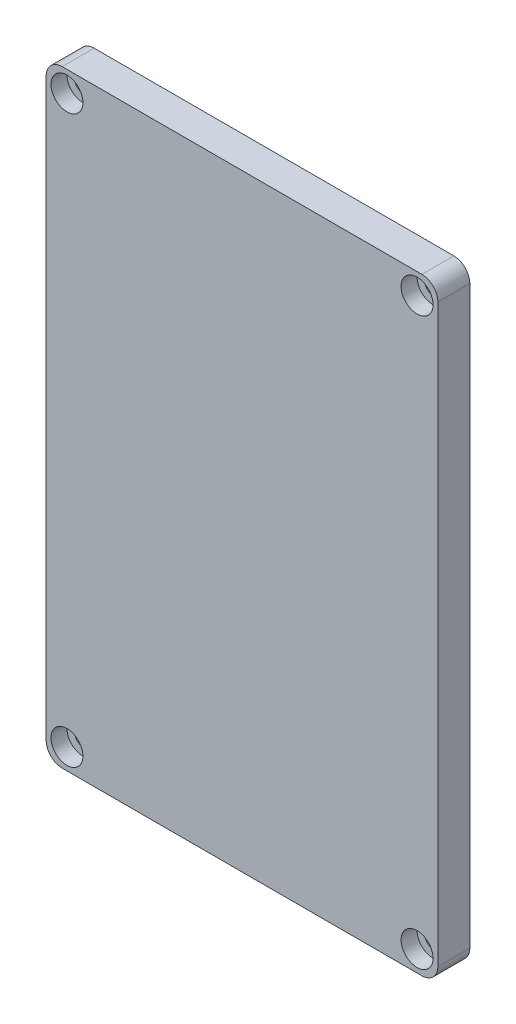
ISO-10303-21;
HEADER;
FILE_DESCRIPTION(('STEP AP214'),'2;1');
FILE_NAME('part.step','',(''),(''),'','','');
FILE_SCHEMA(('AUTOMOTIVE_DESIGN { 1 0 10303 214 1 1 1 1 }'));
ENDSEC;
DATA;
#1=APPLICATION_CONTEXT('core data for automotive mechanical design processes');
#2=APPLICATION_PROTOCOL_DEFINITION('international standard','automotive_design',2000,#1);
#3=PRODUCT_CONTEXT('',#1,'mechanical');
#4=PRODUCT('Part','Part','',(#3));
#5=PRODUCT_RELATED_PRODUCT_CATEGORY('part','',(#4));
#6=PRODUCT_DEFINITION_FORMATION('','',#4);
#7=PRODUCT_DEFINITION_CONTEXT('part definition',#1,'design');
#8=PRODUCT_DEFINITION('design','',#6,#7);
#9=PRODUCT_DEFINITION_SHAPE('','',#8);
#10=(LENGTH_UNIT() NAMED_UNIT(*) SI_UNIT(.MILLI.,.METRE.));
#11=(NAMED_UNIT(*) PLANE_ANGLE_UNIT() SI_UNIT($,.RADIAN.));
#12=(NAMED_UNIT(*) SI_UNIT($,.STERADIAN.) SOLID_ANGLE_UNIT());
#13=UNCERTAINTY_MEASURE_WITH_UNIT(LENGTH_MEASURE(1.E-05),#10,'distance_accuracy_value','');
#14=(GEOMETRIC_REPRESENTATION_CONTEXT(3) GLOBAL_UNCERTAINTY_ASSIGNED_CONTEXT((#13)) GLOBAL_UNIT_ASSIGNED_CONTEXT((#10,
#11,#12)) REPRESENTATION_CONTEXT('',''));
#15=CARTESIAN_POINT('',(0.,0.,0.));
#16=DIRECTION('',(0.,0.,1.));
#17=DIRECTION('',(1.,0.,0.));
#18=AXIS2_PLACEMENT_3D('',#15,#16,#17);
#19=CARTESIAN_POINT('',(0.,0.,0.));
#20=DIRECTION('',(0.,0.,-1.));
#21=DIRECTION('',(-1.,0.,0.));
#22=AXIS2_PLACEMENT_3D('',#19,#20,#21);
#23=PLANE('',#22);
#24=CARTESIAN_POINT('',(-120.990086771129,76.4285838497429,0.));
#25=DIRECTION('',(0.,0.,-1.));
#26=DIRECTION('',(-1.,0.,0.));
#27=AXIS2_PLACEMENT_3D('',#24,#25,#26);
#28=CIRCLE('',#27,0.499999999999999);
#29=CARTESIAN_POINT('',(-121.490086771129,76.4285838497429,0.));
#30=VERTEX_POINT('',#29);
#31=EDGE_CURVE('E227',#30,#30,#28,.F.);
#32=ORIENTED_EDGE('',*,*,#31,.T.);
#33=EDGE_LOOP('',(#32));
#34=FACE_BOUND('',#33,.T.);
#35=CARTESIAN_POINT('',(-99.0900867711287,76.4285838497429,0.));
#36=DIRECTION('',(0.,0.,-1.));
#37=DIRECTION('',(-1.,0.,0.));
#38=AXIS2_PLACEMENT_3D('',#35,#36,#37);
#39=CIRCLE('',#38,0.499999999999999);
#40=CARTESIAN_POINT('',(-99.5900867711287,76.4285838497429,0.));
#41=VERTEX_POINT('',#40);
#42=EDGE_CURVE('E241',#41,#41,#39,.F.);
#43=ORIENTED_EDGE('',*,*,#42,.T.);
#44=EDGE_LOOP('',(#43));
#45=FACE_BOUND('',#44,.T.);
#46=CARTESIAN_POINT('',(-99.0900867711287,41.028583849743,0.));
#47=DIRECTION('',(0.,0.,-1.));
#48=DIRECTION('',(-1.,0.,0.));
#49=AXIS2_PLACEMENT_3D('',#46,#47,#48);
#50=CIRCLE('',#49,0.499999999999999);
#51=CARTESIAN_POINT('',(-99.5900867711287,41.028583849743,0.));
#52=VERTEX_POINT('',#51);
#53=EDGE_CURVE('E233',#52,#52,#50,.F.);
#54=ORIENTED_EDGE('',*,*,#53,.T.);
#55=EDGE_LOOP('',(#54));
#56=FACE_BOUND('',#55,.T.);
#57=CARTESIAN_POINT('',(-120.990086771129,41.028583849743,0.));
#58=DIRECTION('',(0.,0.,-1.));
#59=DIRECTION('',(-1.,0.,0.));
#60=AXIS2_PLACEMENT_3D('',#57,#58,#59);
#61=CIRCLE('',#60,0.499999999999999);
#62=CARTESIAN_POINT('',(-121.490086771129,41.028583849743,0.));
#63=VERTEX_POINT('',#62);
#64=EDGE_CURVE('E232',#63,#63,#61,.F.);
#65=ORIENTED_EDGE('',*,*,#64,.T.);
#66=EDGE_LOOP('',(#65));
#67=FACE_BOUND('',#66,.T.);
#68=CARTESIAN_POINT('',(-118.450086771129,67.7285838497429,0.));
#69=DIRECTION('',(0.,0.,-1.));
#70=DIRECTION('',(-1.,0.,0.));
#71=AXIS2_PLACEMENT_3D('',#68,#69,#70);
#72=CIRCLE('',#71,2.04999999999999);
#73=CARTESIAN_POINT('',(-120.500086771129,67.7285838497429,0.));
#74=VERTEX_POINT('',#73);
#75=EDGE_CURVE('E288',#74,#74,#72,.T.);
#76=ORIENTED_EDGE('',*,*,#75,.F.);
#77=EDGE_LOOP('',(#76));
#78=FACE_BOUND('',#77,.T.);
#79=DIRECTION('',(-1.,0.,0.));
#80=VECTOR('',#79,1.);
#81=CARTESIAN_POINT('',(-97.7900867711287,77.7285838497429,0.));
#82=LINE('',#81,#80);
#83=CARTESIAN_POINT('',(-98.7900867711287,77.7285838497429,0.));
#84=VERTEX_POINT('',#83);
#85=CARTESIAN_POINT('',(-121.290086771129,77.7285838497429,0.));
#86=VERTEX_POINT('',#85);
#87=EDGE_CURVE('E321',#84,#86,#82,.T.);
#88=ORIENTED_EDGE('',*,*,#87,.F.);
#89=CARTESIAN_POINT('',(-98.7900867711287,76.7285838497429,0.));
#90=DIRECTION('',(0.,0.,-1.));
#91=DIRECTION('',(-1.,0.,0.));
#92=AXIS2_PLACEMENT_3D('',#89,#90,#91);
#93=CIRCLE('',#92,1.);
#94=CARTESIAN_POINT('',(-97.7900867711287,76.7285838497429,0.));
#95=VERTEX_POINT('',#94);
#96=EDGE_CURVE('E347',#84,#95,#93,.T.);
#97=ORIENTED_EDGE('',*,*,#96,.T.);
#98=DIRECTION('',(0.,1.,0.));
#99=VECTOR('',#98,1.);
#100=CARTESIAN_POINT('',(-97.7900867711287,77.7285838497429,0.));
#101=LINE('',#100,#99);
#102=CARTESIAN_POINT('',(-97.7900867711287,40.7285838497429,0.));
#103=VERTEX_POINT('',#102);
#104=EDGE_CURVE('E296',#103,#95,#101,.T.);
#105=ORIENTED_EDGE('',*,*,#104,.F.);
#106=CARTESIAN_POINT('',(-98.7900867711287,40.7285838497429,0.));
#107=DIRECTION('',(0.,0.,-1.));
#108=DIRECTION('',(-1.,0.,0.));
#109=AXIS2_PLACEMENT_3D('',#106,#107,#108);
#110=CIRCLE('',#109,1.);
#111=CARTESIAN_POINT('',(-98.7900867711287,39.7285838497429,0.));
#112=VERTEX_POINT('',#111);
#113=EDGE_CURVE('E344',#103,#112,#110,.T.);
#114=ORIENTED_EDGE('',*,*,#113,.T.);
#115=DIRECTION('',(1.,0.,0.));
#116=VECTOR('',#115,1.);
#117=CARTESIAN_POINT('',(-97.7900867711287,39.7285838497429,0.));
#118=LINE('',#117,#116);
#119=CARTESIAN_POINT('',(-121.290086771129,39.7285838497429,0.));
#120=VERTEX_POINT('',#119);
#121=EDGE_CURVE('E305',#120,#112,#118,.T.);
#122=ORIENTED_EDGE('',*,*,#121,.F.);
#123=CARTESIAN_POINT('',(-121.290086771129,40.7285838497429,0.));
#124=DIRECTION('',(0.,0.,-1.));
#125=DIRECTION('',(-1.,0.,0.));
#126=AXIS2_PLACEMENT_3D('',#123,#124,#125);
#127=CIRCLE('',#126,1.);
#128=CARTESIAN_POINT('',(-122.290086771129,40.7285838497429,0.));
#129=VERTEX_POINT('',#128);
#130=EDGE_CURVE('E341',#120,#129,#127,.T.);
#131=ORIENTED_EDGE('',*,*,#130,.T.);
#132=DIRECTION('',(0.,-1.,0.));
#133=VECTOR('',#132,1.);
#134=CARTESIAN_POINT('',(-122.290086771129,77.7285838497429,0.));
#135=LINE('',#134,#133);
#136=CARTESIAN_POINT('',(-122.290086771129,76.7285838497429,0.));
#137=VERTEX_POINT('',#136);
#138=EDGE_CURVE('E325',#137,#129,#135,.T.);
#139=ORIENTED_EDGE('',*,*,#138,.F.);
#140=CARTESIAN_POINT('',(-121.290086771129,76.7285838497429,0.));
#141=DIRECTION('',(0.,0.,-1.));
#142=DIRECTION('',(-1.,0.,0.));
#143=AXIS2_PLACEMENT_3D('',#140,#141,#142);
#144=CIRCLE('',#143,1.);
#145=EDGE_CURVE('E338',#137,#86,#144,.T.);
#146=ORIENTED_EDGE('',*,*,#145,.T.);
#147=EDGE_LOOP('',(#88,#97,#105,#114,#122,#131,#139,#146));
#148=FACE_BOUND('',#147,.T.);
#149=DIRECTION('',(-1.,0.,0.));
#150=VECTOR('',#149,1.);
#151=CARTESIAN_POINT('',(-105.32713911598,64.4228752504134,0.));
#152=LINE('',#151,#150);
#153=CARTESIAN_POINT('',(-105.32713911598,64.4228752504134,0.));
#154=VERTEX_POINT('',#153);
#155=CARTESIAN_POINT('',(-111.090086771129,64.4228752504134,0.));
#156=VERTEX_POINT('',#155);
#157=EDGE_CURVE('E188',#154,#156,#152,.T.);
#158=ORIENTED_EDGE('',*,*,#157,.F.);
#159=DIRECTION('',(0.,-1.,0.));
#160=VECTOR('',#159,1.);
#161=CARTESIAN_POINT('',(-105.32713911598,67.0785838497429,0.));
#162=LINE('',#161,#160);
#163=CARTESIAN_POINT('',(-105.32713911598,67.0785838497429,0.));
#164=VERTEX_POINT('',#163);
#165=EDGE_CURVE('E183',#164,#154,#162,.T.);
#166=ORIENTED_EDGE('',*,*,#165,.F.);
#167=DIRECTION('',(1.,0.,0.));
#168=VECTOR('',#167,1.);
#169=CARTESIAN_POINT('',(-105.32713911598,67.0785838497429,0.));
#170=LINE('',#169,#168);
#171=CARTESIAN_POINT('',(-111.090086771129,67.0785838497429,0.));
#172=VERTEX_POINT('',#171);
#173=EDGE_CURVE('E198',#172,#164,#170,.T.);
#174=ORIENTED_EDGE('',*,*,#173,.F.);
#175=DIRECTION('',(0.,1.,0.));
#176=VECTOR('',#175,1.);
#177=CARTESIAN_POINT('',(-111.090086771129,67.0785838497429,0.));
#178=LINE('',#177,#176);
#179=EDGE_CURVE('E210',#156,#172,#178,.T.);
#180=ORIENTED_EDGE('',*,*,#179,.F.);
#181=EDGE_LOOP('',(#158,#166,#174,#180));
#182=FACE_BOUND('',#181,.T.);
#183=DIRECTION('',(-1.,0.,0.));
#184=VECTOR('',#183,1.);
#185=CARTESIAN_POINT('',(-106.636291242411,49.0285838497429,0.));
#186=LINE('',#185,#184);
#187=CARTESIAN_POINT('',(-106.636291242411,49.0285838497429,0.));
#188=VERTEX_POINT('',#187);
#189=CARTESIAN_POINT('',(-114.636291242411,49.0285838497429,0.));
#190=VERTEX_POINT('',#189);
#191=EDGE_CURVE('E781',#188,#190,#186,.T.);
#192=ORIENTED_EDGE('',*,*,#191,.F.);
#193=DIRECTION('',(0.,-1.,0.));
#194=VECTOR('',#193,1.);
#195=CARTESIAN_POINT('',(-106.636291242411,50.5247577085202,0.));
#196=LINE('',#195,#194);
#197=CARTESIAN_POINT('',(-106.636291242411,50.5247577085202,0.));
#198=VERTEX_POINT('',#197);
#199=EDGE_CURVE('E180',#198,#188,#196,.T.);
#200=ORIENTED_EDGE('',*,*,#199,.F.);
#201=DIRECTION('',(1.,0.,0.));
#202=VECTOR('',#201,1.);
#203=CARTESIAN_POINT('',(-106.636291242411,50.5247577085202,0.));
#204=LINE('',#203,#202);
#205=CARTESIAN_POINT('',(-114.636291242411,50.5247577085202,0.));
#206=VERTEX_POINT('',#205);
#207=EDGE_CURVE('E176',#206,#198,#204,.T.);
#208=ORIENTED_EDGE('',*,*,#207,.F.);
#209=DIRECTION('',(0.,1.,0.));
#210=VECTOR('',#209,1.);
#211=CARTESIAN_POINT('',(-114.636291242411,50.5247577085202,0.));
#212=LINE('',#211,#210);
#213=EDGE_CURVE('E777',#190,#206,#212,.T.);
#214=ORIENTED_EDGE('',*,*,#213,.F.);
#215=EDGE_LOOP('',(#192,#200,#208,#214));
#216=FACE_BOUND('',#215,.T.);
#217=ADVANCED_FACE('F41',(#34,#45,#56,#67,#78,#148,#182,#216),#23,.T.);
#218=CARTESIAN_POINT('',(-97.7900867711287,77.7285838497429,2.));
#219=DIRECTION('',(-1.,0.,0.));
#220=DIRECTION('',(0.,-1.,0.));
#221=AXIS2_PLACEMENT_3D('',#218,#219,#220);
#222=PLANE('',#221);
#223=ORIENTED_EDGE('',*,*,#104,.T.);
#224=DIRECTION('',(0.,0.,-1.));
#225=VECTOR('',#224,1.);
#226=CARTESIAN_POINT('',(-97.7900867711287,76.7285838497429,2.));
#227=LINE('',#226,#225);
#228=CARTESIAN_POINT('',(-97.7900867711287,76.7285838497429,2.));
#229=VERTEX_POINT('',#228);
#230=EDGE_CURVE('E354',#95,#229,#227,.F.);
#231=ORIENTED_EDGE('',*,*,#230,.T.);
#232=DIRECTION('',(0.,1.,0.));
#233=VECTOR('',#232,1.);
#234=CARTESIAN_POINT('',(-97.7900867711287,77.7285838497429,2.));
#235=LINE('',#234,#233);
#236=CARTESIAN_POINT('',(-97.7900867711287,40.7285838497429,2.));
#237=VERTEX_POINT('',#236);
#238=EDGE_CURVE('E300',#237,#229,#235,.T.);
#239=ORIENTED_EDGE('',*,*,#238,.F.);
#240=DIRECTION('',(0.,0.,-1.));
#241=VECTOR('',#240,1.);
#242=CARTESIAN_POINT('',(-97.7900867711287,40.7285838497429,2.));
#243=LINE('',#242,#241);
#244=EDGE_CURVE('E350',#237,#103,#243,.T.);
#245=ORIENTED_EDGE('',*,*,#244,.T.);
#246=EDGE_LOOP('',(#223,#231,#239,#245));
#247=FACE_BOUND('',#246,.T.);
#248=ADVANCED_FACE('F406',(#247),#222,.F.);
#249=CARTESIAN_POINT('',(-97.7900867711287,77.7285838497429,2.));
#250=DIRECTION('',(0.,-1.,0.));
#251=DIRECTION('',(0.,0.,-1.));
#252=AXIS2_PLACEMENT_3D('',#249,#250,#251);
#253=PLANE('',#252);
#254=DIRECTION('',(-1.,0.,0.));
#255=VECTOR('',#254,1.);
#256=CARTESIAN_POINT('',(-97.7900867711287,77.7285838497429,2.));
#257=LINE('',#256,#255);
#258=CARTESIAN_POINT('',(-98.7900867711287,77.7285838497429,2.));
#259=VERTEX_POINT('',#258);
#260=CARTESIAN_POINT('',(-121.290086771129,77.7285838497429,2.));
#261=VERTEX_POINT('',#260);
#262=EDGE_CURVE('E304',#259,#261,#257,.T.);
#263=ORIENTED_EDGE('',*,*,#262,.F.);
#264=DIRECTION('',(0.,0.,-1.));
#265=VECTOR('',#264,1.);
#266=CARTESIAN_POINT('',(-98.7900867711287,77.7285838497429,2.));
#267=LINE('',#266,#265);
#268=EDGE_CURVE('E334',#259,#84,#267,.T.);
#269=ORIENTED_EDGE('',*,*,#268,.T.);
#270=ORIENTED_EDGE('',*,*,#87,.T.);
#271=DIRECTION('',(0.,0.,-1.));
#272=VECTOR('',#271,1.);
#273=CARTESIAN_POINT('',(-121.290086771129,77.7285838497429,2.));
#274=LINE('',#273,#272);
#275=EDGE_CURVE('E317',#86,#261,#274,.F.);
#276=ORIENTED_EDGE('',*,*,#275,.T.);
#277=EDGE_LOOP('',(#263,#269,#270,#276));
#278=FACE_BOUND('',#277,.T.);
#279=ADVANCED_FACE('F414',(#278),#253,.F.);
#280=CARTESIAN_POINT('',(-122.290086771129,77.7285838497429,2.));
#281=DIRECTION('',(1.,0.,0.));
#282=DIRECTION('',(0.,0.,-1.));
#283=AXIS2_PLACEMENT_3D('',#280,#281,#282);
#284=PLANE('',#283);
#285=ORIENTED_EDGE('',*,*,#138,.T.);
#286=DIRECTION('',(0.,0.,-1.));
#287=VECTOR('',#286,1.);
#288=CARTESIAN_POINT('',(-122.290086771129,40.7285838497429,2.));
#289=LINE('',#288,#287);
#290=CARTESIAN_POINT('',(-122.290086771129,40.7285838497429,2.));
#291=VERTEX_POINT('',#290);
#292=EDGE_CURVE('E11',#129,#291,#289,.F.);
#293=ORIENTED_EDGE('',*,*,#292,.T.);
#294=DIRECTION('',(0.,-1.,0.));
#295=VECTOR('',#294,1.);
#296=CARTESIAN_POINT('',(-122.290086771129,77.7285838497429,2.));
#297=LINE('',#296,#295);
#298=CARTESIAN_POINT('',(-122.290086771129,76.7285838497429,2.));
#299=VERTEX_POINT('',#298);
#300=EDGE_CURVE('E309',#299,#291,#297,.T.);
#301=ORIENTED_EDGE('',*,*,#300,.F.);
#302=DIRECTION('',(0.,0.,-1.));
#303=VECTOR('',#302,1.);
#304=CARTESIAN_POINT('',(-122.290086771129,76.7285838497429,2.));
#305=LINE('',#304,#303);
#306=EDGE_CURVE('E50',#299,#137,#305,.T.);
#307=ORIENTED_EDGE('',*,*,#306,.T.);
#308=EDGE_LOOP('',(#285,#293,#301,#307));
#309=FACE_BOUND('',#308,.T.);
#310=ADVANCED_FACE('F381',(#309),#284,.F.);
#311=CARTESIAN_POINT('',(-97.7900867711287,39.7285838497429,2.));
#312=DIRECTION('',(0.,1.,0.));
#313=DIRECTION('',(0.,0.,1.));
#314=AXIS2_PLACEMENT_3D('',#311,#312,#313);
#315=PLANE('',#314);
#316=ORIENTED_EDGE('',*,*,#121,.T.);
#317=DIRECTION('',(0.,0.,-1.));
#318=VECTOR('',#317,1.);
#319=CARTESIAN_POINT('',(-98.7900867711287,39.7285838497429,2.));
#320=LINE('',#319,#318);
#321=CARTESIAN_POINT('',(-98.7900867711287,39.7285838497429,2.));
#322=VERTEX_POINT('',#321);
#323=EDGE_CURVE('E373',#112,#322,#320,.F.);
#324=ORIENTED_EDGE('',*,*,#323,.T.);
#325=DIRECTION('',(1.,0.,0.));
#326=VECTOR('',#325,1.);
#327=CARTESIAN_POINT('',(-97.7900867711287,39.7285838497429,2.));
#328=LINE('',#327,#326);
#329=CARTESIAN_POINT('',(-121.290086771129,39.7285838497429,2.));
#330=VERTEX_POINT('',#329);
#331=EDGE_CURVE('E313',#330,#322,#328,.T.);
#332=ORIENTED_EDGE('',*,*,#331,.F.);
#333=DIRECTION('',(0.,0.,-1.));
#334=VECTOR('',#333,1.);
#335=CARTESIAN_POINT('',(-121.290086771129,39.7285838497429,2.));
#336=LINE('',#335,#334);
#337=EDGE_CURVE('E369',#330,#120,#336,.T.);
#338=ORIENTED_EDGE('',*,*,#337,.T.);
#339=EDGE_LOOP('',(#316,#324,#332,#338));
#340=FACE_BOUND('',#339,.T.);
#341=ADVANCED_FACE('F395',(#340),#315,.F.);
#342=CARTESIAN_POINT('',(0.,0.,2.));
#343=DIRECTION('',(0.,0.,-1.));
#344=DIRECTION('',(-1.,0.,0.));
#345=AXIS2_PLACEMENT_3D('',#342,#343,#344);
#346=PLANE('',#345);
#347=CARTESIAN_POINT('',(-120.990086771129,76.4285838497429,2.));
#348=DIRECTION('',(0.,0.,1.));
#349=DIRECTION('',(1.,0.,0.));
#350=AXIS2_PLACEMENT_3D('',#347,#348,#349);
#351=CIRCLE('',#350,0.999999999999998);
#352=CARTESIAN_POINT('',(-119.990086771129,76.4285838497429,2.));
#353=VERTEX_POINT('',#352);
#354=EDGE_CURVE('E256',#353,#353,#351,.T.);
#355=ORIENTED_EDGE('',*,*,#354,.F.);
#356=EDGE_LOOP('',(#355));
#357=FACE_BOUND('',#356,.T.);
#358=CARTESIAN_POINT('',(-120.990086771129,41.028583849743,2.));
#359=DIRECTION('',(0.,0.,1.));
#360=DIRECTION('',(1.,0.,0.));
#361=AXIS2_PLACEMENT_3D('',#358,#359,#360);
#362=CIRCLE('',#361,0.999999999999998);
#363=CARTESIAN_POINT('',(-119.990086771129,41.028583849743,2.));
#364=VERTEX_POINT('',#363);
#365=EDGE_CURVE('E273',#364,#364,#362,.T.);
#366=ORIENTED_EDGE('',*,*,#365,.F.);
#367=EDGE_LOOP('',(#366));
#368=FACE_BOUND('',#367,.T.);
#369=CARTESIAN_POINT('',(-99.0900867711287,41.028583849743,2.));
#370=DIRECTION('',(0.,0.,1.));
#371=DIRECTION('',(1.,0.,0.));
#372=AXIS2_PLACEMENT_3D('',#369,#370,#371);
#373=CIRCLE('',#372,0.999999999999998);
#374=CARTESIAN_POINT('',(-98.0900867711287,41.028583849743,2.));
#375=VERTEX_POINT('',#374);
#376=EDGE_CURVE('E265',#375,#375,#373,.T.);
#377=ORIENTED_EDGE('',*,*,#376,.F.);
#378=EDGE_LOOP('',(#377));
#379=FACE_BOUND('',#378,.T.);
#380=CARTESIAN_POINT('',(-99.0900867711287,76.4285838497429,2.));
#381=DIRECTION('',(0.,0.,1.));
#382=DIRECTION('',(1.,0.,0.));
#383=AXIS2_PLACEMENT_3D('',#380,#381,#382);
#384=CIRCLE('',#383,0.999999999999998);
#385=CARTESIAN_POINT('',(-98.0900867711287,76.4285838497429,2.));
#386=VERTEX_POINT('',#385);
#387=EDGE_CURVE('E264',#386,#386,#384,.T.);
#388=ORIENTED_EDGE('',*,*,#387,.F.);
#389=EDGE_LOOP('',(#388));
#390=FACE_BOUND('',#389,.T.);
#391=ORIENTED_EDGE('',*,*,#238,.T.);
#392=CARTESIAN_POINT('',(-98.7900867711287,76.7285838497429,2.));
#393=DIRECTION('',(0.,0.,-1.));
#394=DIRECTION('',(-1.,0.,0.));
#395=AXIS2_PLACEMENT_3D('',#392,#393,#394);
#396=CIRCLE('',#395,1.);
#397=EDGE_CURVE('E366',#229,#259,#396,.F.);
#398=ORIENTED_EDGE('',*,*,#397,.T.);
#399=ORIENTED_EDGE('',*,*,#262,.T.);
#400=CARTESIAN_POINT('',(-121.290086771129,76.7285838497429,2.));
#401=DIRECTION('',(0.,0.,-1.));
#402=DIRECTION('',(-1.,0.,0.));
#403=AXIS2_PLACEMENT_3D('',#400,#401,#402);
#404=CIRCLE('',#403,1.);
#405=EDGE_CURVE('E357',#261,#299,#404,.F.);
#406=ORIENTED_EDGE('',*,*,#405,.T.);
#407=ORIENTED_EDGE('',*,*,#300,.T.);
#408=CARTESIAN_POINT('',(-121.290086771129,40.7285838497429,2.));
#409=DIRECTION('',(0.,0.,-1.));
#410=DIRECTION('',(-1.,0.,0.));
#411=AXIS2_PLACEMENT_3D('',#408,#409,#410);
#412=CIRCLE('',#411,1.);
#413=EDGE_CURVE('E360',#291,#330,#412,.F.);
#414=ORIENTED_EDGE('',*,*,#413,.T.);
#415=ORIENTED_EDGE('',*,*,#331,.T.);
#416=CARTESIAN_POINT('',(-98.7900867711287,40.7285838497429,2.));
#417=DIRECTION('',(0.,0.,-1.));
#418=DIRECTION('',(-1.,0.,0.));
#419=AXIS2_PLACEMENT_3D('',#416,#417,#418);
#420=CIRCLE('',#419,1.);
#421=EDGE_CURVE('E363',#322,#237,#420,.F.);
#422=ORIENTED_EDGE('',*,*,#421,.T.);
#423=EDGE_LOOP('',(#391,#398,#399,#406,#407,#414,#415,#422));
#424=FACE_BOUND('',#423,.T.);
#425=ADVANCED_FACE('F399',(#357,#368,#379,#390,#424),#346,.F.);
#426=CARTESIAN_POINT('',(-118.450086771129,67.7285838497429,1.));
#427=DIRECTION('',(0.,0.,-1.));
#428=DIRECTION('',(-1.,0.,0.));
#429=AXIS2_PLACEMENT_3D('',#426,#427,#428);
#430=CYLINDRICAL_SURFACE('',#429,2.04999999999999);
#431=CARTESIAN_POINT('',(-118.450086771129,67.7285838497429,1.));
#432=DIRECTION('',(0.,0.,-1.));
#433=DIRECTION('',(-1.,0.,0.));
#434=AXIS2_PLACEMENT_3D('',#431,#432,#433);
#435=CIRCLE('',#434,2.04999999999999);
#436=CARTESIAN_POINT('',(-120.500086771129,67.7285838497429,1.));
#437=VERTEX_POINT('',#436);
#438=EDGE_CURVE('E292',#437,#437,#435,.T.);
#439=ORIENTED_EDGE('',*,*,#438,.F.);
#440=EDGE_LOOP('',(#439));
#441=FACE_BOUND('',#440,.T.);
#442=ORIENTED_EDGE('',*,*,#75,.T.);
#443=EDGE_LOOP('',(#442));
#444=FACE_BOUND('',#443,.T.);
#445=ADVANCED_FACE('F605',(#441,#444),#430,.F.);
#446=CARTESIAN_POINT('',(-118.450086771129,67.7285838497429,1.));
#447=DIRECTION('',(0.,0.,-1.));
#448=DIRECTION('',(-1.,0.,0.));
#449=AXIS2_PLACEMENT_3D('',#446,#447,#448);
#450=PLANE('',#449);
#451=ORIENTED_EDGE('',*,*,#438,.T.);
#452=EDGE_LOOP('',(#451));
#453=FACE_BOUND('',#452,.T.);
#454=ADVANCED_FACE('F602',(#453),#450,.T.);
#455=CARTESIAN_POINT('',(-99.0900867711287,76.4285838497429,1.));
#456=DIRECTION('',(0.,0.,1.));
#457=DIRECTION('',(1.,0.,0.));
#458=AXIS2_PLACEMENT_3D('',#455,#456,#457);
#459=CYLINDRICAL_SURFACE('',#458,0.999999999999998);
#460=CARTESIAN_POINT('',(-99.0900867711287,76.4285838497429,1.));
#461=DIRECTION('',(0.,0.,1.));
#462=DIRECTION('',(1.,0.,0.));
#463=AXIS2_PLACEMENT_3D('',#460,#461,#462);
#464=CIRCLE('',#463,0.999999999999998);
#465=CARTESIAN_POINT('',(-98.0900867711287,76.4285838497429,1.));
#466=VERTEX_POINT('',#465);
#467=EDGE_CURVE('E284',#466,#466,#464,.T.);
#468=ORIENTED_EDGE('',*,*,#467,.F.);
#469=EDGE_LOOP('',(#468));
#470=FACE_BOUND('',#469,.T.);
#471=ORIENTED_EDGE('',*,*,#387,.T.);
#472=EDGE_LOOP('',(#471));
#473=FACE_BOUND('',#472,.T.);
#474=ADVANCED_FACE('F598',(#470,#473),#459,.F.);
#475=CARTESIAN_POINT('',(-99.0900867711287,76.4285838497429,1.));
#476=DIRECTION('',(0.,0.,1.));
#477=DIRECTION('',(1.,0.,0.));
#478=AXIS2_PLACEMENT_3D('',#475,#476,#477);
#479=PLANE('',#478);
#480=CARTESIAN_POINT('',(-99.0900867711287,76.4285838497429,1.));
#481=DIRECTION('',(0.,0.,1.));
#482=DIRECTION('',(1.,0.,0.));
#483=AXIS2_PLACEMENT_3D('',#480,#481,#482);
#484=CIRCLE('',#483,0.499999999999999);
#485=CARTESIAN_POINT('',(-98.5900867711287,76.4285838497429,1.));
#486=VERTEX_POINT('',#485);
#487=EDGE_CURVE('E237',#486,#486,#484,.T.);
#488=ORIENTED_EDGE('',*,*,#487,.F.);
#489=EDGE_LOOP('',(#488));
#490=FACE_BOUND('',#489,.T.);
#491=ORIENTED_EDGE('',*,*,#467,.T.);
#492=EDGE_LOOP('',(#491));
#493=FACE_BOUND('',#492,.T.);
#494=ADVANCED_FACE('F580',(#490,#493),#479,.T.);
#495=CARTESIAN_POINT('',(-99.0900867711287,41.028583849743,1.));
#496=DIRECTION('',(0.,0.,1.));
#497=DIRECTION('',(1.,0.,0.));
#498=AXIS2_PLACEMENT_3D('',#495,#496,#497);
#499=CYLINDRICAL_SURFACE('',#498,0.999999999999998);
#500=CARTESIAN_POINT('',(-99.0900867711287,41.028583849743,1.));
#501=DIRECTION('',(0.,0.,1.));
#502=DIRECTION('',(1.,0.,0.));
#503=AXIS2_PLACEMENT_3D('',#500,#501,#502);
#504=CIRCLE('',#503,0.999999999999998);
#505=CARTESIAN_POINT('',(-98.0900867711287,41.028583849743,1.));
#506=VERTEX_POINT('',#505);
#507=EDGE_CURVE('E260',#506,#506,#504,.T.);
#508=ORIENTED_EDGE('',*,*,#507,.F.);
#509=EDGE_LOOP('',(#508));
#510=FACE_BOUND('',#509,.T.);
#511=ORIENTED_EDGE('',*,*,#376,.T.);
#512=EDGE_LOOP('',(#511));
#513=FACE_BOUND('',#512,.T.);
#514=ADVANCED_FACE('F576',(#510,#513),#499,.F.);
#515=CARTESIAN_POINT('',(-99.0900867711287,41.028583849743,1.));
#516=DIRECTION('',(0.,0.,1.));
#517=DIRECTION('',(1.,0.,0.));
#518=AXIS2_PLACEMENT_3D('',#515,#516,#517);
#519=PLANE('',#518);
#520=CARTESIAN_POINT('',(-99.0900867711287,41.028583849743,1.));
#521=DIRECTION('',(0.,0.,1.));
#522=DIRECTION('',(1.,0.,0.));
#523=AXIS2_PLACEMENT_3D('',#520,#521,#522);
#524=CIRCLE('',#523,0.499999999999999);
#525=CARTESIAN_POINT('',(-98.5900867711287,41.028583849743,1.));
#526=VERTEX_POINT('',#525);
#527=EDGE_CURVE('E228',#526,#526,#524,.T.);
#528=ORIENTED_EDGE('',*,*,#527,.F.);
#529=EDGE_LOOP('',(#528));
#530=FACE_BOUND('',#529,.T.);
#531=ORIENTED_EDGE('',*,*,#507,.T.);
#532=EDGE_LOOP('',(#531));
#533=FACE_BOUND('',#532,.T.);
#534=ADVANCED_FACE('F572',(#530,#533),#519,.T.);
#535=CARTESIAN_POINT('',(-120.990086771129,41.028583849743,1.));
#536=DIRECTION('',(0.,0.,1.));
#537=DIRECTION('',(1.,0.,0.));
#538=AXIS2_PLACEMENT_3D('',#535,#536,#537);
#539=CYLINDRICAL_SURFACE('',#538,0.999999999999998);
#540=CARTESIAN_POINT('',(-120.990086771129,41.028583849743,1.));
#541=DIRECTION('',(0.,0.,1.));
#542=DIRECTION('',(1.,0.,0.));
#543=AXIS2_PLACEMENT_3D('',#540,#541,#542);
#544=CIRCLE('',#543,0.999999999999998);
#545=CARTESIAN_POINT('',(-119.990086771129,41.028583849743,1.));
#546=VERTEX_POINT('',#545);
#547=EDGE_CURVE('E269',#546,#546,#544,.T.);
#548=ORIENTED_EDGE('',*,*,#547,.F.);
#549=EDGE_LOOP('',(#548));
#550=FACE_BOUND('',#549,.T.);
#551=ORIENTED_EDGE('',*,*,#365,.T.);
#552=EDGE_LOOP('',(#551));
#553=FACE_BOUND('',#552,.T.);
#554=ADVANCED_FACE('F575',(#550,#553),#539,.F.);
#555=CARTESIAN_POINT('',(-120.990086771129,41.028583849743,1.));
#556=DIRECTION('',(0.,0.,1.));
#557=DIRECTION('',(1.,0.,0.));
#558=AXIS2_PLACEMENT_3D('',#555,#556,#557);
#559=PLANE('',#558);
#560=CARTESIAN_POINT('',(-120.990086771129,41.028583849743,1.));
#561=DIRECTION('',(0.,0.,1.));
#562=DIRECTION('',(1.,0.,0.));
#563=AXIS2_PLACEMENT_3D('',#560,#561,#562);
#564=CIRCLE('',#563,0.499999999999999);
#565=CARTESIAN_POINT('',(-120.490086771129,41.028583849743,1.));
#566=VERTEX_POINT('',#565);
#567=EDGE_CURVE('E252',#566,#566,#564,.T.);
#568=ORIENTED_EDGE('',*,*,#567,.F.);
#569=EDGE_LOOP('',(#568));
#570=FACE_BOUND('',#569,.T.);
#571=ORIENTED_EDGE('',*,*,#547,.T.);
#572=EDGE_LOOP('',(#571));
#573=FACE_BOUND('',#572,.T.);
#574=ADVANCED_FACE('F582',(#570,#573),#559,.T.);
#575=CARTESIAN_POINT('',(-120.990086771129,76.4285838497429,1.));
#576=DIRECTION('',(0.,0.,1.));
#577=DIRECTION('',(1.,0.,0.));
#578=AXIS2_PLACEMENT_3D('',#575,#576,#577);
#579=CYLINDRICAL_SURFACE('',#578,0.999999999999998);
#580=CARTESIAN_POINT('',(-120.990086771129,76.4285838497429,1.));
#581=DIRECTION('',(0.,0.,1.));
#582=DIRECTION('',(1.,0.,0.));
#583=AXIS2_PLACEMENT_3D('',#580,#581,#582);
#584=CIRCLE('',#583,0.999999999999998);
#585=CARTESIAN_POINT('',(-119.990086771129,76.4285838497429,1.));
#586=VERTEX_POINT('',#585);
#587=EDGE_CURVE('E277',#586,#586,#584,.T.);
#588=ORIENTED_EDGE('',*,*,#587,.F.);
#589=EDGE_LOOP('',(#588));
#590=FACE_BOUND('',#589,.T.);
#591=ORIENTED_EDGE('',*,*,#354,.T.);
#592=EDGE_LOOP('',(#591));
#593=FACE_BOUND('',#592,.T.);
#594=ADVANCED_FACE('F585',(#590,#593),#579,.F.);
#595=CARTESIAN_POINT('',(-120.990086771129,76.4285838497429,1.));
#596=DIRECTION('',(0.,0.,1.));
#597=DIRECTION('',(1.,0.,0.));
#598=AXIS2_PLACEMENT_3D('',#595,#596,#597);
#599=PLANE('',#598);
#600=CARTESIAN_POINT('',(-120.990086771129,76.4285838497429,1.));
#601=DIRECTION('',(0.,0.,1.));
#602=DIRECTION('',(1.,0.,0.));
#603=AXIS2_PLACEMENT_3D('',#600,#601,#602);
#604=CIRCLE('',#603,0.499999999999999);
#605=CARTESIAN_POINT('',(-120.490086771129,76.4285838497429,1.));
#606=VERTEX_POINT('',#605);
#607=EDGE_CURVE('E245',#606,#606,#604,.T.);
#608=ORIENTED_EDGE('',*,*,#607,.F.);
#609=EDGE_LOOP('',(#608));
#610=FACE_BOUND('',#609,.T.);
#611=ORIENTED_EDGE('',*,*,#587,.T.);
#612=EDGE_LOOP('',(#611));
#613=FACE_BOUND('',#612,.T.);
#614=ADVANCED_FACE('F570',(#610,#613),#599,.T.);
#615=CARTESIAN_POINT('',(-120.990086771129,41.028583849743,-0.000999999999999916));
#616=DIRECTION('',(0.,0.,1.));
#617=DIRECTION('',(1.,0.,0.));
#618=AXIS2_PLACEMENT_3D('',#615,#616,#617);
#619=CYLINDRICAL_SURFACE('',#618,0.499999999999999);
#620=ORIENTED_EDGE('',*,*,#64,.F.);
#621=EDGE_LOOP('',(#620));
#622=FACE_BOUND('',#621,.T.);
#623=ORIENTED_EDGE('',*,*,#567,.T.);
#624=EDGE_LOOP('',(#623));
#625=FACE_BOUND('',#624,.T.);
#626=ADVANCED_FACE('F561',(#622,#625),#619,.F.);
#627=CARTESIAN_POINT('',(-99.0900867711287,41.028583849743,-0.000999999999999916));
#628=DIRECTION('',(0.,0.,1.));
#629=DIRECTION('',(1.,0.,0.));
#630=AXIS2_PLACEMENT_3D('',#627,#628,#629);
#631=CYLINDRICAL_SURFACE('',#630,0.499999999999999);
#632=ORIENTED_EDGE('',*,*,#53,.F.);
#633=EDGE_LOOP('',(#632));
#634=FACE_BOUND('',#633,.T.);
#635=ORIENTED_EDGE('',*,*,#527,.T.);
#636=EDGE_LOOP('',(#635));
#637=FACE_BOUND('',#636,.T.);
#638=ADVANCED_FACE('F557',(#634,#637),#631,.F.);
#639=CARTESIAN_POINT('',(-99.0900867711287,76.4285838497429,-0.000999999999999916));
#640=DIRECTION('',(0.,0.,1.));
#641=DIRECTION('',(1.,0.,0.));
#642=AXIS2_PLACEMENT_3D('',#639,#640,#641);
#643=CYLINDRICAL_SURFACE('',#642,0.499999999999999);
#644=ORIENTED_EDGE('',*,*,#42,.F.);
#645=EDGE_LOOP('',(#644));
#646=FACE_BOUND('',#645,.T.);
#647=ORIENTED_EDGE('',*,*,#487,.T.);
#648=EDGE_LOOP('',(#647));
#649=FACE_BOUND('',#648,.T.);
#650=ADVANCED_FACE('F560',(#646,#649),#643,.F.);
#651=CARTESIAN_POINT('',(-120.990086771129,76.4285838497429,-0.000999999999999916));
#652=DIRECTION('',(0.,0.,1.));
#653=DIRECTION('',(1.,0.,0.));
#654=AXIS2_PLACEMENT_3D('',#651,#652,#653);
#655=CYLINDRICAL_SURFACE('',#654,0.499999999999999);
#656=ORIENTED_EDGE('',*,*,#31,.F.);
#657=EDGE_LOOP('',(#656));
#658=FACE_BOUND('',#657,.T.);
#659=ORIENTED_EDGE('',*,*,#607,.T.);
#660=EDGE_LOOP('',(#659));
#661=FACE_BOUND('',#660,.T.);
#662=ADVANCED_FACE('F444',(#658,#661),#655,.F.);
#663=CARTESIAN_POINT('',(-98.7900867711287,76.7285838497429,2.));
#664=DIRECTION('',(0.,0.,-1.));
#665=DIRECTION('',(-1.,0.,0.));
#666=AXIS2_PLACEMENT_3D('',#663,#664,#665);
#667=CYLINDRICAL_SURFACE('',#666,1.);
#668=ORIENTED_EDGE('',*,*,#397,.F.);
#669=ORIENTED_EDGE('',*,*,#230,.F.);
#670=ORIENTED_EDGE('',*,*,#96,.F.);
#671=ORIENTED_EDGE('',*,*,#268,.F.);
#672=EDGE_LOOP('',(#668,#669,#670,#671));
#673=FACE_BOUND('',#672,.T.);
#674=ADVANCED_FACE('F411',(#673),#667,.T.);
#675=CARTESIAN_POINT('',(-98.7900867711287,40.7285838497429,2.));
#676=DIRECTION('',(0.,0.,-1.));
#677=DIRECTION('',(-1.,0.,0.));
#678=AXIS2_PLACEMENT_3D('',#675,#676,#677);
#679=CYLINDRICAL_SURFACE('',#678,1.);
#680=ORIENTED_EDGE('',*,*,#421,.F.);
#681=ORIENTED_EDGE('',*,*,#323,.F.);
#682=ORIENTED_EDGE('',*,*,#113,.F.);
#683=ORIENTED_EDGE('',*,*,#244,.F.);
#684=EDGE_LOOP('',(#680,#681,#682,#683));
#685=FACE_BOUND('',#684,.T.);
#686=ADVANCED_FACE('F403',(#685),#679,.T.);
#687=CARTESIAN_POINT('',(-121.290086771129,40.7285838497429,2.));
#688=DIRECTION('',(0.,0.,-1.));
#689=DIRECTION('',(-1.,0.,0.));
#690=AXIS2_PLACEMENT_3D('',#687,#688,#689);
#691=CYLINDRICAL_SURFACE('',#690,1.);
#692=ORIENTED_EDGE('',*,*,#413,.F.);
#693=ORIENTED_EDGE('',*,*,#292,.F.);
#694=ORIENTED_EDGE('',*,*,#130,.F.);
#695=ORIENTED_EDGE('',*,*,#337,.F.);
#696=EDGE_LOOP('',(#692,#693,#694,#695));
#697=FACE_BOUND('',#696,.T.);
#698=ADVANCED_FACE('F392',(#697),#691,.T.);
#699=CARTESIAN_POINT('',(-121.290086771129,76.7285838497429,2.));
#700=DIRECTION('',(0.,0.,-1.));
#701=DIRECTION('',(-1.,0.,0.));
#702=AXIS2_PLACEMENT_3D('',#699,#700,#701);
#703=CYLINDRICAL_SURFACE('',#702,1.);
#704=ORIENTED_EDGE('',*,*,#405,.F.);
#705=ORIENTED_EDGE('',*,*,#275,.F.);
#706=ORIENTED_EDGE('',*,*,#145,.F.);
#707=ORIENTED_EDGE('',*,*,#306,.F.);
#708=EDGE_LOOP('',(#704,#705,#706,#707));
#709=FACE_BOUND('',#708,.T.);
#710=ADVANCED_FACE('F43',(#709),#703,.T.);
#711=CARTESIAN_POINT('',(-105.32713911598,67.0785838497429,-5.));
#712=DIRECTION('',(-1.,0.,0.));
#713=DIRECTION('',(0.,0.,1.));
#714=AXIS2_PLACEMENT_3D('',#711,#712,#713);
#715=PLANE('',#714);
#716=ORIENTED_EDGE('',*,*,#165,.T.);
#717=DIRECTION('',(0.,0.,1.));
#718=VECTOR('',#717,1.);
#719=CARTESIAN_POINT('',(-105.32713911598,64.4228752504134,-5.));
#720=LINE('',#719,#718);
#721=CARTESIAN_POINT('',(-105.32713911598,64.4228752504134,-5.));
#722=VERTEX_POINT('',#721);
#723=EDGE_CURVE('E224',#722,#154,#720,.T.);
#724=ORIENTED_EDGE('',*,*,#723,.F.);
#725=DIRECTION('',(0.,-1.,0.));
#726=VECTOR('',#725,1.);
#727=CARTESIAN_POINT('',(-105.32713911598,67.0785838497429,-5.));
#728=LINE('',#727,#726);
#729=CARTESIAN_POINT('',(-105.32713911598,67.0785838497429,-5.));
#730=VERTEX_POINT('',#729);
#731=EDGE_CURVE('E193',#730,#722,#728,.T.);
#732=ORIENTED_EDGE('',*,*,#731,.F.);
#733=DIRECTION('',(0.,0.,1.));
#734=VECTOR('',#733,1.);
#735=CARTESIAN_POINT('',(-105.32713911598,67.0785838497429,-5.));
#736=LINE('',#735,#734);
#737=EDGE_CURVE('E206',#730,#164,#736,.T.);
#738=ORIENTED_EDGE('',*,*,#737,.T.);
#739=EDGE_LOOP('',(#716,#724,#732,#738));
#740=FACE_BOUND('',#739,.T.);
#741=ADVANCED_FACE('F417',(#740),#715,.F.);
#742=CARTESIAN_POINT('',(-105.32713911598,64.4228752504134,-5.));
#743=DIRECTION('',(0.,1.,0.));
#744=DIRECTION('',(0.,0.,1.));
#745=AXIS2_PLACEMENT_3D('',#742,#743,#744);
#746=PLANE('',#745);
#747=ORIENTED_EDGE('',*,*,#157,.T.);
#748=DIRECTION('',(0.,0.,1.));
#749=VECTOR('',#748,1.);
#750=CARTESIAN_POINT('',(-111.090086771129,64.4228752504134,-5.));
#751=LINE('',#750,#749);
#752=CARTESIAN_POINT('',(-111.090086771129,64.4228752504134,-5.));
#753=VERTEX_POINT('',#752);
#754=EDGE_CURVE('E220',#753,#156,#751,.T.);
#755=ORIENTED_EDGE('',*,*,#754,.F.);
#756=DIRECTION('',(-1.,0.,0.));
#757=VECTOR('',#756,1.);
#758=CARTESIAN_POINT('',(-105.32713911598,64.4228752504134,-5.));
#759=LINE('',#758,#757);
#760=EDGE_CURVE('E197',#722,#753,#759,.T.);
#761=ORIENTED_EDGE('',*,*,#760,.F.);
#762=ORIENTED_EDGE('',*,*,#723,.T.);
#763=EDGE_LOOP('',(#747,#755,#761,#762));
#764=FACE_BOUND('',#763,.T.);
#765=ADVANCED_FACE('F422',(#764),#746,.F.);
#766=CARTESIAN_POINT('',(-111.090086771129,67.0785838497429,-5.));
#767=DIRECTION('',(1.,0.,0.));
#768=DIRECTION('',(0.,0.,-1.));
#769=AXIS2_PLACEMENT_3D('',#766,#767,#768);
#770=PLANE('',#769);
#771=ORIENTED_EDGE('',*,*,#179,.T.);
#772=DIRECTION('',(0.,0.,1.));
#773=VECTOR('',#772,1.);
#774=CARTESIAN_POINT('',(-111.090086771129,67.0785838497429,-5.));
#775=LINE('',#774,#773);
#776=CARTESIAN_POINT('',(-111.090086771129,67.0785838497429,-5.));
#777=VERTEX_POINT('',#776);
#778=EDGE_CURVE('E65',#777,#172,#775,.T.);
#779=ORIENTED_EDGE('',*,*,#778,.F.);
#780=DIRECTION('',(0.,1.,0.));
#781=VECTOR('',#780,1.);
#782=CARTESIAN_POINT('',(-111.090086771129,67.0785838497429,-5.));
#783=LINE('',#782,#781);
#784=EDGE_CURVE('E201',#753,#777,#783,.T.);
#785=ORIENTED_EDGE('',*,*,#784,.F.);
#786=ORIENTED_EDGE('',*,*,#754,.T.);
#787=EDGE_LOOP('',(#771,#779,#785,#786));
#788=FACE_BOUND('',#787,.T.);
#789=ADVANCED_FACE('F474',(#788),#770,.F.);
#790=CARTESIAN_POINT('',(-105.32713911598,67.0785838497429,-5.));
#791=DIRECTION('',(0.,-1.,0.));
#792=DIRECTION('',(0.,0.,-1.));
#793=AXIS2_PLACEMENT_3D('',#790,#791,#792);
#794=PLANE('',#793);
#795=ORIENTED_EDGE('',*,*,#173,.T.);
#796=ORIENTED_EDGE('',*,*,#737,.F.);
#797=DIRECTION('',(1.,0.,0.));
#798=VECTOR('',#797,1.);
#799=CARTESIAN_POINT('',(-105.32713911598,67.0785838497429,-5.));
#800=LINE('',#799,#798);
#801=EDGE_CURVE('E204',#777,#730,#800,.T.);
#802=ORIENTED_EDGE('',*,*,#801,.F.);
#803=ORIENTED_EDGE('',*,*,#778,.T.);
#804=EDGE_LOOP('',(#795,#796,#802,#803));
#805=FACE_BOUND('',#804,.T.);
#806=ADVANCED_FACE('F484',(#805),#794,.F.);
#807=CARTESIAN_POINT('',(0.,0.,-5.));
#808=DIRECTION('',(0.,0.,-1.));
#809=DIRECTION('',(-1.,0.,0.));
#810=AXIS2_PLACEMENT_3D('',#807,#808,#809);
#811=PLANE('',#810);
#812=ORIENTED_EDGE('',*,*,#731,.T.);
#813=ORIENTED_EDGE('',*,*,#760,.T.);
#814=ORIENTED_EDGE('',*,*,#784,.T.);
#815=ORIENTED_EDGE('',*,*,#801,.T.);
#816=EDGE_LOOP('',(#812,#813,#814,#815));
#817=FACE_BOUND('',#816,.T.);
#818=ADVANCED_FACE('F494',(#817),#811,.T.);
#819=CARTESIAN_POINT('',(-106.636291242411,50.5247577085202,-5.));
#820=DIRECTION('',(-1.,0.,0.));
#821=DIRECTION('',(0.,0.,1.));
#822=AXIS2_PLACEMENT_3D('',#819,#820,#821);
#823=PLANE('',#822);
#824=ORIENTED_EDGE('',*,*,#199,.T.);
#825=DIRECTION('',(0.,0.,1.));
#826=VECTOR('',#825,1.);
#827=CARTESIAN_POINT('',(-106.636291242411,49.0285838497429,-5.));
#828=LINE('',#827,#826);
#829=CARTESIAN_POINT('',(-106.636291242411,49.0285838497429,-5.));
#830=VERTEX_POINT('',#829);
#831=EDGE_CURVE('E159',#830,#188,#828,.T.);
#832=ORIENTED_EDGE('',*,*,#831,.F.);
#833=DIRECTION('',(0.,-1.,0.));
#834=VECTOR('',#833,1.);
#835=CARTESIAN_POINT('',(-106.636291242411,50.5247577085202,-5.));
#836=LINE('',#835,#834);
#837=CARTESIAN_POINT('',(-106.636291242411,50.5247577085202,-5.));
#838=VERTEX_POINT('',#837);
#839=EDGE_CURVE('E167',#838,#830,#836,.T.);
#840=ORIENTED_EDGE('',*,*,#839,.F.);
#841=DIRECTION('',(0.,0.,1.));
#842=VECTOR('',#841,1.);
#843=CARTESIAN_POINT('',(-106.636291242411,50.5247577085202,-5.));
#844=LINE('',#843,#842);
#845=EDGE_CURVE('E773',#838,#198,#844,.T.);
#846=ORIENTED_EDGE('',*,*,#845,.T.);
#847=EDGE_LOOP('',(#824,#832,#840,#846));
#848=FACE_BOUND('',#847,.T.);
#849=ADVANCED_FACE('F178',(#848),#823,.F.);
#850=CARTESIAN_POINT('',(-106.636291242411,49.0285838497429,-5.));
#851=DIRECTION('',(0.,1.,0.));
#852=DIRECTION('',(0.,0.,1.));
#853=AXIS2_PLACEMENT_3D('',#850,#851,#852);
#854=PLANE('',#853);
#855=ORIENTED_EDGE('',*,*,#191,.T.);
#856=DIRECTION('',(0.,0.,1.));
#857=VECTOR('',#856,1.);
#858=CARTESIAN_POINT('',(-114.636291242411,49.0285838497429,-5.));
#859=LINE('',#858,#857);
#860=CARTESIAN_POINT('',(-114.636291242411,49.0285838497429,-5.));
#861=VERTEX_POINT('',#860);
#862=EDGE_CURVE('E162',#861,#190,#859,.T.);
#863=ORIENTED_EDGE('',*,*,#862,.F.);
#864=DIRECTION('',(-1.,0.,0.));
#865=VECTOR('',#864,1.);
#866=CARTESIAN_POINT('',(-106.636291242411,49.0285838497429,-5.));
#867=LINE('',#866,#865);
#868=EDGE_CURVE('E155',#830,#861,#867,.T.);
#869=ORIENTED_EDGE('',*,*,#868,.F.);
#870=ORIENTED_EDGE('',*,*,#831,.T.);
#871=EDGE_LOOP('',(#855,#863,#869,#870));
#872=FACE_BOUND('',#871,.T.);
#873=ADVANCED_FACE('F157',(#872),#854,.F.);
#874=CARTESIAN_POINT('',(-114.636291242411,50.5247577085202,-5.));
#875=DIRECTION('',(1.,0.,0.));
#876=DIRECTION('',(0.,0.,-1.));
#877=AXIS2_PLACEMENT_3D('',#874,#875,#876);
#878=PLANE('',#877);
#879=ORIENTED_EDGE('',*,*,#213,.T.);
#880=DIRECTION('',(0.,0.,1.));
#881=VECTOR('',#880,1.);
#882=CARTESIAN_POINT('',(-114.636291242411,50.5247577085202,-5.));
#883=LINE('',#882,#881);
#884=CARTESIAN_POINT('',(-114.636291242411,50.5247577085202,-5.));
#885=VERTEX_POINT('',#884);
#886=EDGE_CURVE('E57',#885,#206,#883,.T.);
#887=ORIENTED_EDGE('',*,*,#886,.F.);
#888=DIRECTION('',(0.,1.,0.));
#889=VECTOR('',#888,1.);
#890=CARTESIAN_POINT('',(-114.636291242411,50.5247577085202,-5.));
#891=LINE('',#890,#889);
#892=EDGE_CURVE('E166',#861,#885,#891,.T.);
#893=ORIENTED_EDGE('',*,*,#892,.F.);
#894=ORIENTED_EDGE('',*,*,#862,.T.);
#895=EDGE_LOOP('',(#879,#887,#893,#894));
#896=FACE_BOUND('',#895,.T.);
#897=ADVANCED_FACE('F526',(#896),#878,.F.);
#898=CARTESIAN_POINT('',(-106.636291242411,50.5247577085202,-5.));
#899=DIRECTION('',(0.,-1.,0.));
#900=DIRECTION('',(0.,0.,-1.));
#901=AXIS2_PLACEMENT_3D('',#898,#899,#900);
#902=PLANE('',#901);
#903=ORIENTED_EDGE('',*,*,#207,.T.);
#904=ORIENTED_EDGE('',*,*,#845,.F.);
#905=DIRECTION('',(1.,0.,0.));
#906=VECTOR('',#905,1.);
#907=CARTESIAN_POINT('',(-106.636291242411,50.5247577085202,-5.));
#908=LINE('',#907,#906);
#909=EDGE_CURVE('E171',#885,#838,#908,.T.);
#910=ORIENTED_EDGE('',*,*,#909,.F.);
#911=ORIENTED_EDGE('',*,*,#886,.T.);
#912=EDGE_LOOP('',(#903,#904,#910,#911));
#913=FACE_BOUND('',#912,.T.);
#914=ADVANCED_FACE('F535',(#913),#902,.F.);
#915=CARTESIAN_POINT('',(0.,0.,-5.));
#916=DIRECTION('',(0.,0.,-1.));
#917=DIRECTION('',(-1.,0.,0.));
#918=AXIS2_PLACEMENT_3D('',#915,#916,#917);
#919=PLANE('',#918);
#920=ORIENTED_EDGE('',*,*,#839,.T.);
#921=ORIENTED_EDGE('',*,*,#868,.T.);
#922=ORIENTED_EDGE('',*,*,#892,.T.);
#923=ORIENTED_EDGE('',*,*,#909,.T.);
#924=EDGE_LOOP('',(#920,#921,#922,#923));
#925=FACE_BOUND('',#924,.T.);
#926=ADVANCED_FACE('F170',(#925),#919,.T.);
#927=CLOSED_SHELL('',(#217,#248,#279,#310,#341,#425,#445,#454,#474,#494,#514,#534,#554,#574,
#594,#614,#626,#638,#650,#662,#674,#686,#698,#710,#741,#765,#789,#806,#818,#849,#873,#897,#914,#926));
#928=MANIFOLD_SOLID_BREP('B2',#927);
#929=ADVANCED_BREP_SHAPE_REPRESENTATION('',(#18,#928),#14);
#930=SHAPE_DEFINITION_REPRESENTATION(#9,#929);
ENDSEC;
END-ISO-10303-21;
